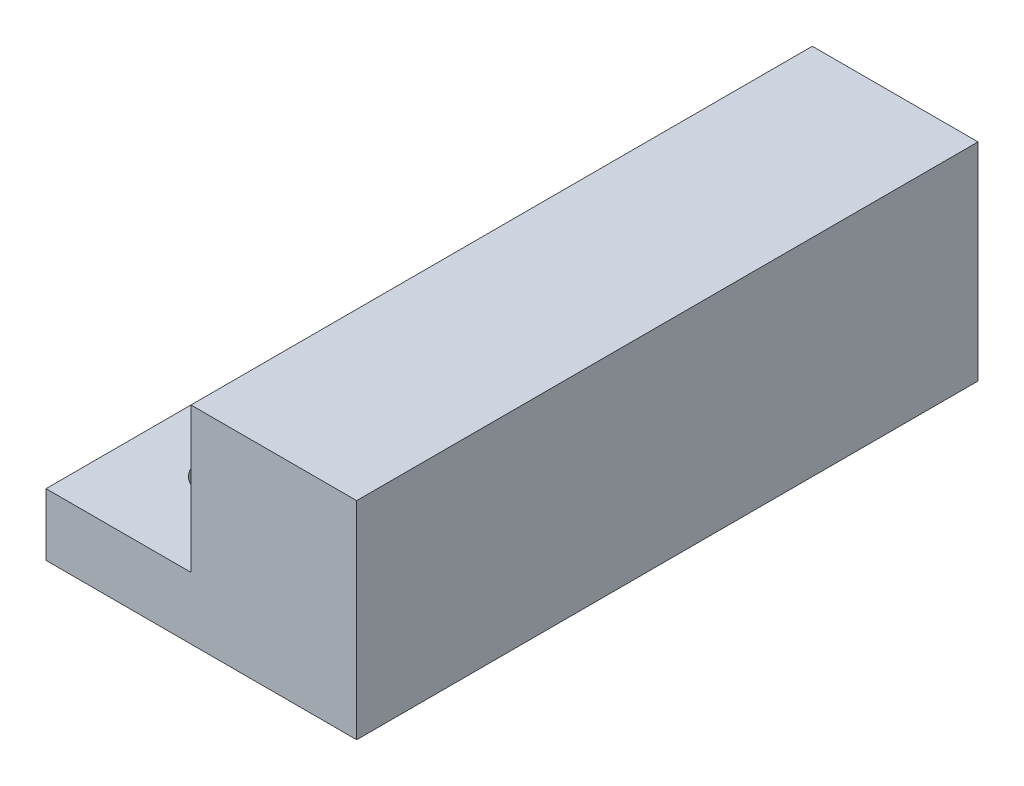
ISO-10303-21;
HEADER;
FILE_DESCRIPTION(('STEP AP214'),'2;1');
FILE_NAME('part.step','',(''),(''),'','','');
FILE_SCHEMA(('AUTOMOTIVE_DESIGN { 1 0 10303 214 1 1 1 1 }'));
ENDSEC;
DATA;
#1=APPLICATION_CONTEXT('core data for automotive mechanical design processes');
#2=APPLICATION_PROTOCOL_DEFINITION('international standard','automotive_design',2000,#1);
#3=PRODUCT_CONTEXT('',#1,'mechanical');
#4=PRODUCT('Part','Part','',(#3));
#5=PRODUCT_RELATED_PRODUCT_CATEGORY('part','',(#4));
#6=PRODUCT_DEFINITION_FORMATION('','',#4);
#7=PRODUCT_DEFINITION_CONTEXT('part definition',#1,'design');
#8=PRODUCT_DEFINITION('design','',#6,#7);
#9=PRODUCT_DEFINITION_SHAPE('','',#8);
#10=(LENGTH_UNIT() NAMED_UNIT(*) SI_UNIT(.MILLI.,.METRE.));
#11=(NAMED_UNIT(*) PLANE_ANGLE_UNIT() SI_UNIT($,.RADIAN.));
#12=(NAMED_UNIT(*) SI_UNIT($,.STERADIAN.) SOLID_ANGLE_UNIT());
#13=UNCERTAINTY_MEASURE_WITH_UNIT(LENGTH_MEASURE(1.E-05),#10,'distance_accuracy_value','');
#14=(GEOMETRIC_REPRESENTATION_CONTEXT(3) GLOBAL_UNCERTAINTY_ASSIGNED_CONTEXT((#13)) GLOBAL_UNIT_ASSIGNED_CONTEXT((#10,
#11,#12)) REPRESENTATION_CONTEXT('',''));
#15=CARTESIAN_POINT('',(0.,0.,0.));
#16=DIRECTION('',(0.,0.,1.));
#17=DIRECTION('',(1.,0.,0.));
#18=AXIS2_PLACEMENT_3D('',#15,#16,#17);
#19=CARTESIAN_POINT('',(10.16,3.81,0.));
#20=DIRECTION('',(0.,1.,0.));
#21=DIRECTION('',(0.,0.,1.));
#22=AXIS2_PLACEMENT_3D('',#19,#20,#21);
#23=PLANE('',#22);
#24=DIRECTION('',(0.,0.,-1.));
#25=VECTOR('',#24,1.);
#26=CARTESIAN_POINT('',(21.59,3.81,29.21));
#27=LINE('',#26,#25);
#28=CARTESIAN_POINT('',(21.59,3.81,29.21));
#29=VERTEX_POINT('',#28);
#30=CARTESIAN_POINT('',(21.59,3.81,-6.35));
#31=VERTEX_POINT('',#30);
#32=EDGE_CURVE('E178',#29,#31,#27,.T.);
#33=ORIENTED_EDGE('',*,*,#32,.T.);
#34=DIRECTION('',(1.,0.,0.));
#35=VECTOR('',#34,1.);
#36=CARTESIAN_POINT('',(24.13,3.81,-6.35));
#37=LINE('',#36,#35);
#38=CARTESIAN_POINT('',(16.51,3.81,-6.35));
#39=VERTEX_POINT('',#38);
#40=EDGE_CURVE('E236',#39,#31,#37,.T.);
#41=ORIENTED_EDGE('',*,*,#40,.F.);
#42=DIRECTION('',(0.,0.,1.));
#43=VECTOR('',#42,1.);
#44=CARTESIAN_POINT('',(16.51,3.81,-6.35));
#45=LINE('',#44,#43);
#46=CARTESIAN_POINT('',(16.51,3.81,29.21));
#47=VERTEX_POINT('',#46);
#48=EDGE_CURVE('E182',#39,#47,#45,.T.);
#49=ORIENTED_EDGE('',*,*,#48,.T.);
#50=DIRECTION('',(1.,0.,0.));
#51=VECTOR('',#50,1.);
#52=CARTESIAN_POINT('',(16.51,3.81,29.21));
#53=LINE('',#52,#51);
#54=EDGE_CURVE('E186',#47,#29,#53,.T.);
#55=ORIENTED_EDGE('',*,*,#54,.T.);
#56=EDGE_LOOP('',(#33,#41,#49,#55));
#57=FACE_BOUND('',#56,.T.);
#58=ADVANCED_FACE('F44',(#57),#23,.T.);
#59=DIRECTION('',(0.,0.,-1.));
#60=VECTOR('',#59,1.);
#61=CARTESIAN_POINT('',(13.97,3.81,31.75));
#62=LINE('',#61,#60);
#63=CARTESIAN_POINT('',(13.97,3.81,31.75));
#64=VERTEX_POINT('',#63);
#65=CARTESIAN_POINT('',(13.97,3.81,-6.35));
#66=VERTEX_POINT('',#65);
#67=EDGE_CURVE('E171',#64,#66,#62,.T.);
#68=ORIENTED_EDGE('',*,*,#67,.T.);
#69=CARTESIAN_POINT('',(5.08,3.81,-6.35));
#70=VERTEX_POINT('',#69);
#71=EDGE_CURVE('E237',#70,#66,#37,.T.);
#72=ORIENTED_EDGE('',*,*,#71,.F.);
#73=DIRECTION('',(0.,0.,-1.));
#74=VECTOR('',#73,1.);
#75=CARTESIAN_POINT('',(5.08,3.81,-6.35));
#76=LINE('',#75,#74);
#77=CARTESIAN_POINT('',(5.08,3.81,31.75));
#78=VERTEX_POINT('',#77);
#79=EDGE_CURVE('E231',#78,#70,#76,.T.);
#80=ORIENTED_EDGE('',*,*,#79,.F.);
#81=DIRECTION('',(-1.,0.,0.));
#82=VECTOR('',#81,1.);
#83=CARTESIAN_POINT('',(24.13,3.81,31.75));
#84=LINE('',#83,#82);
#85=EDGE_CURVE('E227',#64,#78,#84,.T.);
#86=ORIENTED_EDGE('',*,*,#85,.F.);
#87=EDGE_LOOP('',(#68,#72,#80,#86));
#88=FACE_BOUND('',#87,.T.);
#89=CARTESIAN_POINT('',(10.16,3.81,0.));
#90=DIRECTION('',(0.,-1.,0.));
#91=DIRECTION('',(0.,0.,1.));
#92=AXIS2_PLACEMENT_3D('',#89,#90,#91);
#93=CIRCLE('',#92,1.905);
#94=CARTESIAN_POINT('',(10.16,3.81,-1.905));
#95=VERTEX_POINT('',#94);
#96=EDGE_CURVE('E219',#95,#95,#93,.T.);
#97=ORIENTED_EDGE('',*,*,#96,.T.);
#98=EDGE_LOOP('',(#97));
#99=FACE_BOUND('',#98,.T.);
#100=CARTESIAN_POINT('',(10.16,3.81,25.4));
#101=DIRECTION('',(0.,-1.,0.));
#102=DIRECTION('',(0.,0.,1.));
#103=AXIS2_PLACEMENT_3D('',#100,#101,#102);
#104=CIRCLE('',#103,1.905);
#105=CARTESIAN_POINT('',(10.16,3.81,23.495));
#106=VERTEX_POINT('',#105);
#107=EDGE_CURVE('E211',#106,#106,#104,.T.);
#108=ORIENTED_EDGE('',*,*,#107,.T.);
#109=EDGE_LOOP('',(#108));
#110=FACE_BOUND('',#109,.T.);
#111=ADVANCED_FACE('F309',(#88,#99,#110),#23,.T.);
#112=CARTESIAN_POINT('',(10.16,0.,0.));
#113=DIRECTION('',(0.,1.,0.));
#114=DIRECTION('',(0.,0.,1.));
#115=AXIS2_PLACEMENT_3D('',#112,#113,#114);
#116=PLANE('',#115);
#117=DIRECTION('',(0.,0.,1.));
#118=VECTOR('',#117,1.);
#119=CARTESIAN_POINT('',(24.13,0.,-6.35));
#120=LINE('',#119,#118);
#121=CARTESIAN_POINT('',(24.13,0.,-6.35));
#122=VERTEX_POINT('',#121);
#123=CARTESIAN_POINT('',(24.13,0.,31.75));
#124=VERTEX_POINT('',#123);
#125=EDGE_CURVE('E223',#122,#124,#120,.T.);
#126=ORIENTED_EDGE('',*,*,#125,.T.);
#127=DIRECTION('',(-1.,0.,0.));
#128=VECTOR('',#127,1.);
#129=CARTESIAN_POINT('',(24.13,0.,31.75));
#130=LINE('',#129,#128);
#131=CARTESIAN_POINT('',(5.08,0.,31.75));
#132=VERTEX_POINT('',#131);
#133=EDGE_CURVE('E150',#124,#132,#130,.T.);
#134=ORIENTED_EDGE('',*,*,#133,.T.);
#135=DIRECTION('',(0.,0.,-1.));
#136=VECTOR('',#135,1.);
#137=CARTESIAN_POINT('',(5.08,0.,-6.35));
#138=LINE('',#137,#136);
#139=CARTESIAN_POINT('',(5.08,0.,-6.35));
#140=VERTEX_POINT('',#139);
#141=EDGE_CURVE('E245',#132,#140,#138,.T.);
#142=ORIENTED_EDGE('',*,*,#141,.T.);
#143=DIRECTION('',(1.,0.,0.));
#144=VECTOR('',#143,1.);
#145=CARTESIAN_POINT('',(24.13,0.,-6.35));
#146=LINE('',#145,#144);
#147=EDGE_CURVE('E232',#140,#122,#146,.T.);
#148=ORIENTED_EDGE('',*,*,#147,.T.);
#149=EDGE_LOOP('',(#126,#134,#142,#148));
#150=FACE_BOUND('',#149,.T.);
#151=CARTESIAN_POINT('',(10.16,0.,0.));
#152=DIRECTION('',(0.,-1.,0.));
#153=DIRECTION('',(0.,0.,1.));
#154=AXIS2_PLACEMENT_3D('',#151,#152,#153);
#155=CIRCLE('',#154,1.905);
#156=CARTESIAN_POINT('',(10.16,0.,-1.905));
#157=VERTEX_POINT('',#156);
#158=EDGE_CURVE('E215',#157,#157,#155,.T.);
#159=ORIENTED_EDGE('',*,*,#158,.F.);
#160=EDGE_LOOP('',(#159));
#161=FACE_BOUND('',#160,.T.);
#162=CARTESIAN_POINT('',(10.16,0.,25.4));
#163=DIRECTION('',(0.,-1.,0.));
#164=DIRECTION('',(0.,0.,1.));
#165=AXIS2_PLACEMENT_3D('',#162,#163,#164);
#166=CIRCLE('',#165,1.905);
#167=CARTESIAN_POINT('',(10.16,0.,23.495));
#168=VERTEX_POINT('',#167);
#169=EDGE_CURVE('E210',#168,#168,#166,.T.);
#170=ORIENTED_EDGE('',*,*,#169,.F.);
#171=EDGE_LOOP('',(#170));
#172=FACE_BOUND('',#171,.T.);
#173=ADVANCED_FACE('F314',(#150,#161,#172),#116,.F.);
#174=CARTESIAN_POINT('',(24.13,3.81,-6.35));
#175=DIRECTION('',(-1.,0.,0.));
#176=DIRECTION('',(0.,0.,-1.));
#177=AXIS2_PLACEMENT_3D('',#174,#175,#176);
#178=PLANE('',#177);
#179=ORIENTED_EDGE('',*,*,#125,.F.);
#180=DIRECTION('',(0.,-1.,0.));
#181=VECTOR('',#180,1.);
#182=CARTESIAN_POINT('',(24.13,3.81,-6.35));
#183=LINE('',#182,#181);
#184=CARTESIAN_POINT('',(24.13,12.7,-6.35));
#185=VERTEX_POINT('',#184);
#186=EDGE_CURVE('E159',#185,#122,#183,.T.);
#187=ORIENTED_EDGE('',*,*,#186,.F.);
#188=DIRECTION('',(0.,0.,1.));
#189=VECTOR('',#188,1.);
#190=CARTESIAN_POINT('',(24.13,12.7,-6.35));
#191=LINE('',#190,#189);
#192=CARTESIAN_POINT('',(24.13,12.7,31.75));
#193=VERTEX_POINT('',#192);
#194=EDGE_CURVE('E139',#185,#193,#191,.T.);
#195=ORIENTED_EDGE('',*,*,#194,.T.);
#196=DIRECTION('',(0.,-1.,0.));
#197=VECTOR('',#196,1.);
#198=CARTESIAN_POINT('',(24.13,3.81,31.75));
#199=LINE('',#198,#197);
#200=EDGE_CURVE('E147',#193,#124,#199,.T.);
#201=ORIENTED_EDGE('',*,*,#200,.T.);
#202=EDGE_LOOP('',(#179,#187,#195,#201));
#203=FACE_BOUND('',#202,.T.);
#204=ADVANCED_FACE('F158',(#203),#178,.F.);
#205=CARTESIAN_POINT('',(24.13,3.81,31.75));
#206=DIRECTION('',(0.,0.,-1.));
#207=DIRECTION('',(1.,0.,0.));
#208=AXIS2_PLACEMENT_3D('',#205,#206,#207);
#209=PLANE('',#208);
#210=ORIENTED_EDGE('',*,*,#133,.F.);
#211=ORIENTED_EDGE('',*,*,#200,.F.);
#212=DIRECTION('',(-1.,0.,0.));
#213=VECTOR('',#212,1.);
#214=CARTESIAN_POINT('',(24.13,12.7,31.75));
#215=LINE('',#214,#213);
#216=CARTESIAN_POINT('',(13.97,12.7,31.75));
#217=VERTEX_POINT('',#216);
#218=EDGE_CURVE('E134',#193,#217,#215,.T.);
#219=ORIENTED_EDGE('',*,*,#218,.T.);
#220=DIRECTION('',(0.,-1.,0.));
#221=VECTOR('',#220,1.);
#222=CARTESIAN_POINT('',(13.97,10.16,31.75));
#223=LINE('',#222,#221);
#224=EDGE_CURVE('E207',#217,#64,#223,.T.);
#225=ORIENTED_EDGE('',*,*,#224,.T.);
#226=ORIENTED_EDGE('',*,*,#85,.T.);
#227=DIRECTION('',(0.,-1.,0.));
#228=VECTOR('',#227,1.);
#229=CARTESIAN_POINT('',(5.08,3.81,31.75));
#230=LINE('',#229,#228);
#231=EDGE_CURVE('E156',#78,#132,#230,.T.);
#232=ORIENTED_EDGE('',*,*,#231,.T.);
#233=EDGE_LOOP('',(#210,#211,#219,#225,#226,#232));
#234=FACE_BOUND('',#233,.T.);
#235=ADVANCED_FACE('F148',(#234),#209,.F.);
#236=CARTESIAN_POINT('',(5.08,3.81,-6.35));
#237=DIRECTION('',(1.,0.,0.));
#238=DIRECTION('',(0.,0.,1.));
#239=AXIS2_PLACEMENT_3D('',#236,#237,#238);
#240=PLANE('',#239);
#241=ORIENTED_EDGE('',*,*,#141,.F.);
#242=ORIENTED_EDGE('',*,*,#231,.F.);
#243=ORIENTED_EDGE('',*,*,#79,.T.);
#244=DIRECTION('',(0.,-1.,0.));
#245=VECTOR('',#244,1.);
#246=CARTESIAN_POINT('',(5.08,3.81,-6.35));
#247=LINE('',#246,#245);
#248=EDGE_CURVE('E254',#70,#140,#247,.T.);
#249=ORIENTED_EDGE('',*,*,#248,.T.);
#250=EDGE_LOOP('',(#241,#242,#243,#249));
#251=FACE_BOUND('',#250,.T.);
#252=ADVANCED_FACE('F325',(#251),#240,.F.);
#253=CARTESIAN_POINT('',(24.13,3.81,-6.35));
#254=DIRECTION('',(0.,0.,1.));
#255=DIRECTION('',(-1.,0.,0.));
#256=AXIS2_PLACEMENT_3D('',#253,#254,#255);
#257=PLANE('',#256);
#258=ORIENTED_EDGE('',*,*,#186,.T.);
#259=ORIENTED_EDGE('',*,*,#147,.F.);
#260=ORIENTED_EDGE('',*,*,#248,.F.);
#261=ORIENTED_EDGE('',*,*,#71,.T.);
#262=DIRECTION('',(0.,-1.,0.));
#263=VECTOR('',#262,1.);
#264=CARTESIAN_POINT('',(13.97,10.16,-6.35));
#265=LINE('',#264,#263);
#266=CARTESIAN_POINT('',(13.97,12.7,-6.35));
#267=VERTEX_POINT('',#266);
#268=EDGE_CURVE('E204',#267,#66,#265,.T.);
#269=ORIENTED_EDGE('',*,*,#268,.F.);
#270=DIRECTION('',(1.,0.,0.));
#271=VECTOR('',#270,1.);
#272=CARTESIAN_POINT('',(24.13,12.7,-6.35));
#273=LINE('',#272,#271);
#274=EDGE_CURVE('E169',#267,#185,#273,.T.);
#275=ORIENTED_EDGE('',*,*,#274,.T.);
#276=EDGE_LOOP('',(#258,#259,#260,#261,#269,#275));
#277=FACE_BOUND('',#276,.T.);
#278=DIRECTION('',(0.,-1.,0.));
#279=VECTOR('',#278,1.);
#280=CARTESIAN_POINT('',(16.51,10.16,-6.35));
#281=LINE('',#280,#279);
#282=CARTESIAN_POINT('',(16.51,8.89000000000001,-6.35));
#283=VERTEX_POINT('',#282);
#284=EDGE_CURVE('E201',#283,#39,#281,.T.);
#285=ORIENTED_EDGE('',*,*,#284,.T.);
#286=ORIENTED_EDGE('',*,*,#40,.T.);
#287=DIRECTION('',(0.,-1.,0.));
#288=VECTOR('',#287,1.);
#289=CARTESIAN_POINT('',(21.59,10.16,-6.35));
#290=LINE('',#289,#288);
#291=CARTESIAN_POINT('',(21.59,8.89,-6.35));
#292=VERTEX_POINT('',#291);
#293=EDGE_CURVE('E177',#292,#31,#290,.T.);
#294=ORIENTED_EDGE('',*,*,#293,.F.);
#295=DIRECTION('',(-0.707106781186551,0.707106781186544,0.));
#296=VECTOR('',#295,1.);
#297=CARTESIAN_POINT('',(25.4,5.08000000000003,-6.35));
#298=LINE('',#297,#296);
#299=CARTESIAN_POINT('',(20.32,10.16,-6.35));
#300=VERTEX_POINT('',#299);
#301=EDGE_CURVE('E11',#300,#292,#298,.F.);
#302=ORIENTED_EDGE('',*,*,#301,.F.);
#303=DIRECTION('',(1.,0.,0.));
#304=VECTOR('',#303,1.);
#305=CARTESIAN_POINT('',(24.13,10.16,-6.35));
#306=LINE('',#305,#304);
#307=CARTESIAN_POINT('',(17.78,10.16,-6.35));
#308=VERTEX_POINT('',#307);
#309=EDGE_CURVE('E161',#308,#300,#306,.T.);
#310=ORIENTED_EDGE('',*,*,#309,.F.);
#311=DIRECTION('',(-0.707106781186552,-0.707106781186543,0.));
#312=VECTOR('',#311,1.);
#313=CARTESIAN_POINT('',(17.78,10.16,-6.35));
#314=LINE('',#313,#312);
#315=EDGE_CURVE('E53',#283,#308,#314,.F.);
#316=ORIENTED_EDGE('',*,*,#315,.F.);
#317=EDGE_LOOP('',(#285,#286,#294,#302,#310,#316));
#318=FACE_BOUND('',#317,.T.);
#319=ADVANCED_FACE('F281',(#277,#318),#257,.F.);
#320=CARTESIAN_POINT('',(10.16,3.81,0.));
#321=DIRECTION('',(0.,-1.,0.));
#322=DIRECTION('',(0.,0.,-1.));
#323=AXIS2_PLACEMENT_3D('',#320,#321,#322);
#324=CYLINDRICAL_SURFACE('',#323,1.905);
#325=CARTESIAN_POINT('',(10.16,3.81,-1.905));
#326=CARTESIAN_POINT('',(10.16,3.7703125,-1.905));
#327=CARTESIAN_POINT('',(10.16,3.730625,-1.905));
#328=CARTESIAN_POINT('',(10.16,3.65125,-1.905));
#329=CARTESIAN_POINT('',(10.16,3.6115625,-1.905));
#330=CARTESIAN_POINT('',(10.16,3.5321875,-1.905));
#331=CARTESIAN_POINT('',(10.16,3.4925,-1.905));
#332=CARTESIAN_POINT('',(10.16,3.413125,-1.905));
#333=CARTESIAN_POINT('',(10.16,3.3734375,-1.905));
#334=CARTESIAN_POINT('',(10.16,3.2940625,-1.905));
#335=CARTESIAN_POINT('',(10.16,3.254375,-1.905));
#336=CARTESIAN_POINT('',(10.16,3.175,-1.905));
#337=CARTESIAN_POINT('',(10.16,3.1353125,-1.905));
#338=CARTESIAN_POINT('',(10.16,3.0559375,-1.905));
#339=CARTESIAN_POINT('',(10.16,3.01625,-1.905));
#340=CARTESIAN_POINT('',(10.16,2.936875,-1.905));
#341=CARTESIAN_POINT('',(10.16,2.8971875,-1.905));
#342=CARTESIAN_POINT('',(10.16,2.8178125,-1.905));
#343=CARTESIAN_POINT('',(10.16,2.778125,-1.905));
#344=CARTESIAN_POINT('',(10.16,2.69875,-1.905));
#345=CARTESIAN_POINT('',(10.16,2.6590625,-1.905));
#346=CARTESIAN_POINT('',(10.16,2.5796875,-1.905));
#347=CARTESIAN_POINT('',(10.16,2.54,-1.905));
#348=CARTESIAN_POINT('',(10.16,2.460625,-1.905));
#349=CARTESIAN_POINT('',(10.16,2.4209375,-1.905));
#350=CARTESIAN_POINT('',(10.16,2.3415625,-1.905));
#351=CARTESIAN_POINT('',(10.16,2.301875,-1.905));
#352=CARTESIAN_POINT('',(10.16,2.2225,-1.905));
#353=CARTESIAN_POINT('',(10.16,2.1828125,-1.905));
#354=CARTESIAN_POINT('',(10.16,2.1034375,-1.905));
#355=CARTESIAN_POINT('',(10.16,2.06375,-1.905));
#356=CARTESIAN_POINT('',(10.16,1.984375,-1.905));
#357=CARTESIAN_POINT('',(10.16,1.9446875,-1.905));
#358=CARTESIAN_POINT('',(10.16,1.8653125,-1.905));
#359=CARTESIAN_POINT('',(10.16,1.825625,-1.905));
#360=CARTESIAN_POINT('',(10.16,1.74625,-1.905));
#361=CARTESIAN_POINT('',(10.16,1.7065625,-1.905));
#362=CARTESIAN_POINT('',(10.16,1.6271875,-1.905));
#363=CARTESIAN_POINT('',(10.16,1.5875,-1.905));
#364=CARTESIAN_POINT('',(10.16,1.508125,-1.905));
#365=CARTESIAN_POINT('',(10.16,1.4684375,-1.905));
#366=CARTESIAN_POINT('',(10.16,1.3890625,-1.905));
#367=CARTESIAN_POINT('',(10.16,1.349375,-1.905));
#368=CARTESIAN_POINT('',(10.16,1.27,-1.905));
#369=CARTESIAN_POINT('',(10.16,1.2303125,-1.905));
#370=CARTESIAN_POINT('',(10.16,1.1509375,-1.905));
#371=CARTESIAN_POINT('',(10.16,1.11125,-1.905));
#372=CARTESIAN_POINT('',(10.16,1.031875,-1.905));
#373=CARTESIAN_POINT('',(10.16,0.9921875,-1.905));
#374=CARTESIAN_POINT('',(10.16,0.9128125,-1.905));
#375=CARTESIAN_POINT('',(10.16,0.873125,-1.905));
#376=CARTESIAN_POINT('',(10.16,0.79375,-1.905));
#377=CARTESIAN_POINT('',(10.16,0.7540625,-1.905));
#378=CARTESIAN_POINT('',(10.16,0.6746875,-1.905));
#379=CARTESIAN_POINT('',(10.16,0.635,-1.905));
#380=CARTESIAN_POINT('',(10.16,0.555625,-1.905));
#381=CARTESIAN_POINT('',(10.16,0.5159375,-1.905));
#382=CARTESIAN_POINT('',(10.16,0.4365625,-1.905));
#383=CARTESIAN_POINT('',(10.16,0.396875,-1.905));
#384=CARTESIAN_POINT('',(10.16,0.3175,-1.905));
#385=CARTESIAN_POINT('',(10.16,0.2778125,-1.905));
#386=CARTESIAN_POINT('',(10.16,0.1984375,-1.905));
#387=CARTESIAN_POINT('',(10.16,0.15875,-1.905));
#388=CARTESIAN_POINT('',(10.16,0.0793749999999999,-1.905));
#389=CARTESIAN_POINT('',(10.16,0.0396874999999999,-1.905));
#390=CARTESIAN_POINT('',(10.16,0.,-1.905));
#391=B_SPLINE_CURVE_WITH_KNOTS('',3,(#325,#326,#327,#328,#329,#330,#331,#332,#333,#334,#335,
#336,#337,#338,#339,#340,#341,#342,#343,#344,#345,#346,#347,#348,#349,#350,#351,#352,#353,#354,
#355,#356,#357,#358,#359,#360,#361,#362,#363,#364,#365,#366,#367,#368,#369,#370,#371,#372,#373,
#374,#375,#376,#377,#378,#379,#380,#381,#382,#383,#384,#385,#386,#387,#388,#389,#390),
.UNSPECIFIED.,.F.,.F.,(4,2,2,2,2,2,2,2,2,2,2,2,2,2,2,2,2,2,2,2,2,2,2,2,2,2,2,2,2,2,2,2,4),(0.,
0.1190625,0.238125,0.3571875,0.47625,0.5953125,0.714375,0.833437499999999,0.9525,1.0715625,
1.190625,1.3096875,1.42875,1.5478125,1.666875,1.7859375,1.905,2.0240625,2.143125,2.2621875,
2.38125,2.5003125,2.619375,2.7384375,2.8575,2.9765625,3.095625,3.2146875,3.33375,3.4528125,
3.571875,3.6909375,3.81),.UNSPECIFIED.);
#392=EDGE_CURVE('BSEAM318',#95,#157,#391,.T.);
#393=ORIENTED_EDGE('',*,*,#96,.F.);
#394=ORIENTED_EDGE('',*,*,#158,.T.);
#395=ORIENTED_EDGE('',*,*,#392,.T.);
#396=ORIENTED_EDGE('',*,*,#392,.F.);
#397=EDGE_LOOP('',(#393,#395,#394,#396));
#398=FACE_BOUND('',#397,.T.);
#399=ADVANCED_FACE('F318',(#398),#324,.F.);
#400=CARTESIAN_POINT('',(10.16,3.81,25.4));
#401=DIRECTION('',(0.,-1.,0.));
#402=DIRECTION('',(0.,0.,-1.));
#403=AXIS2_PLACEMENT_3D('',#400,#401,#402);
#404=CYLINDRICAL_SURFACE('',#403,1.905);
#405=CARTESIAN_POINT('',(10.16,3.81,23.495));
#406=CARTESIAN_POINT('',(10.16,3.7703125,23.495));
#407=CARTESIAN_POINT('',(10.16,3.730625,23.495));
#408=CARTESIAN_POINT('',(10.16,3.65125,23.495));
#409=CARTESIAN_POINT('',(10.16,3.6115625,23.495));
#410=CARTESIAN_POINT('',(10.16,3.5321875,23.495));
#411=CARTESIAN_POINT('',(10.16,3.4925,23.495));
#412=CARTESIAN_POINT('',(10.16,3.413125,23.495));
#413=CARTESIAN_POINT('',(10.16,3.3734375,23.495));
#414=CARTESIAN_POINT('',(10.16,3.2940625,23.495));
#415=CARTESIAN_POINT('',(10.16,3.254375,23.495));
#416=CARTESIAN_POINT('',(10.16,3.175,23.495));
#417=CARTESIAN_POINT('',(10.16,3.1353125,23.495));
#418=CARTESIAN_POINT('',(10.16,3.0559375,23.495));
#419=CARTESIAN_POINT('',(10.16,3.01625,23.495));
#420=CARTESIAN_POINT('',(10.16,2.936875,23.495));
#421=CARTESIAN_POINT('',(10.16,2.8971875,23.495));
#422=CARTESIAN_POINT('',(10.16,2.8178125,23.495));
#423=CARTESIAN_POINT('',(10.16,2.778125,23.495));
#424=CARTESIAN_POINT('',(10.16,2.69875,23.495));
#425=CARTESIAN_POINT('',(10.16,2.6590625,23.495));
#426=CARTESIAN_POINT('',(10.16,2.5796875,23.495));
#427=CARTESIAN_POINT('',(10.16,2.54,23.495));
#428=CARTESIAN_POINT('',(10.16,2.460625,23.495));
#429=CARTESIAN_POINT('',(10.16,2.4209375,23.495));
#430=CARTESIAN_POINT('',(10.16,2.3415625,23.495));
#431=CARTESIAN_POINT('',(10.16,2.301875,23.495));
#432=CARTESIAN_POINT('',(10.16,2.2225,23.495));
#433=CARTESIAN_POINT('',(10.16,2.1828125,23.495));
#434=CARTESIAN_POINT('',(10.16,2.1034375,23.495));
#435=CARTESIAN_POINT('',(10.16,2.06375,23.495));
#436=CARTESIAN_POINT('',(10.16,1.984375,23.495));
#437=CARTESIAN_POINT('',(10.16,1.9446875,23.495));
#438=CARTESIAN_POINT('',(10.16,1.8653125,23.495));
#439=CARTESIAN_POINT('',(10.16,1.825625,23.495));
#440=CARTESIAN_POINT('',(10.16,1.74625,23.495));
#441=CARTESIAN_POINT('',(10.16,1.7065625,23.495));
#442=CARTESIAN_POINT('',(10.16,1.6271875,23.495));
#443=CARTESIAN_POINT('',(10.16,1.5875,23.495));
#444=CARTESIAN_POINT('',(10.16,1.508125,23.495));
#445=CARTESIAN_POINT('',(10.16,1.4684375,23.495));
#446=CARTESIAN_POINT('',(10.16,1.3890625,23.495));
#447=CARTESIAN_POINT('',(10.16,1.349375,23.495));
#448=CARTESIAN_POINT('',(10.16,1.27,23.495));
#449=CARTESIAN_POINT('',(10.16,1.2303125,23.495));
#450=CARTESIAN_POINT('',(10.16,1.1509375,23.495));
#451=CARTESIAN_POINT('',(10.16,1.11125,23.495));
#452=CARTESIAN_POINT('',(10.16,1.031875,23.495));
#453=CARTESIAN_POINT('',(10.16,0.9921875,23.495));
#454=CARTESIAN_POINT('',(10.16,0.9128125,23.495));
#455=CARTESIAN_POINT('',(10.16,0.873125,23.495));
#456=CARTESIAN_POINT('',(10.16,0.79375,23.495));
#457=CARTESIAN_POINT('',(10.16,0.7540625,23.495));
#458=CARTESIAN_POINT('',(10.16,0.6746875,23.495));
#459=CARTESIAN_POINT('',(10.16,0.635,23.495));
#460=CARTESIAN_POINT('',(10.16,0.555625,23.495));
#461=CARTESIAN_POINT('',(10.16,0.5159375,23.495));
#462=CARTESIAN_POINT('',(10.16,0.4365625,23.495));
#463=CARTESIAN_POINT('',(10.16,0.396875,23.495));
#464=CARTESIAN_POINT('',(10.16,0.3175,23.495));
#465=CARTESIAN_POINT('',(10.16,0.2778125,23.495));
#466=CARTESIAN_POINT('',(10.16,0.1984375,23.495));
#467=CARTESIAN_POINT('',(10.16,0.15875,23.495));
#468=CARTESIAN_POINT('',(10.16,0.0793749999999999,23.495));
#469=CARTESIAN_POINT('',(10.16,0.0396874999999999,23.495));
#470=CARTESIAN_POINT('',(10.16,0.,23.495));
#471=B_SPLINE_CURVE_WITH_KNOTS('',3,(#405,#406,#407,#408,#409,#410,#411,#412,#413,#414,#415,
#416,#417,#418,#419,#420,#421,#422,#423,#424,#425,#426,#427,#428,#429,#430,#431,#432,#433,#434,
#435,#436,#437,#438,#439,#440,#441,#442,#443,#444,#445,#446,#447,#448,#449,#450,#451,#452,#453,
#454,#455,#456,#457,#458,#459,#460,#461,#462,#463,#464,#465,#466,#467,#468,#469,#470),
.UNSPECIFIED.,.F.,.F.,(4,2,2,2,2,2,2,2,2,2,2,2,2,2,2,2,2,2,2,2,2,2,2,2,2,2,2,2,2,2,2,2,4),(0.,
0.1190625,0.238125,0.3571875,0.47625,0.5953125,0.714375,0.833437499999999,0.9525,1.0715625,
1.190625,1.3096875,1.42875,1.5478125,1.666875,1.7859375,1.905,2.0240625,2.143125,2.2621875,
2.38125,2.5003125,2.619375,2.7384375,2.8575,2.9765625,3.095625,3.2146875,3.33375,3.4528125,
3.571875,3.6909375,3.81),.UNSPECIFIED.);
#472=EDGE_CURVE('BSEAM380',#106,#168,#471,.T.);
#473=ORIENTED_EDGE('',*,*,#107,.F.);
#474=ORIENTED_EDGE('',*,*,#169,.T.);
#475=ORIENTED_EDGE('',*,*,#472,.T.);
#476=ORIENTED_EDGE('',*,*,#472,.F.);
#477=EDGE_LOOP('',(#473,#475,#474,#476));
#478=FACE_BOUND('',#477,.T.);
#479=ADVANCED_FACE('F380',(#478),#404,.F.);
#480=CARTESIAN_POINT('',(13.97,10.16,31.75));
#481=DIRECTION('',(1.,0.,0.));
#482=DIRECTION('',(0.,0.,1.));
#483=AXIS2_PLACEMENT_3D('',#480,#481,#482);
#484=PLANE('',#483);
#485=ORIENTED_EDGE('',*,*,#67,.F.);
#486=ORIENTED_EDGE('',*,*,#224,.F.);
#487=DIRECTION('',(0.,0.,-1.));
#488=VECTOR('',#487,1.);
#489=CARTESIAN_POINT('',(13.97,12.7,-6.35));
#490=LINE('',#489,#488);
#491=EDGE_CURVE('E141',#217,#267,#490,.T.);
#492=ORIENTED_EDGE('',*,*,#491,.T.);
#493=ORIENTED_EDGE('',*,*,#268,.T.);
#494=EDGE_LOOP('',(#485,#486,#492,#493));
#495=FACE_BOUND('',#494,.T.);
#496=ADVANCED_FACE('F370',(#495),#484,.F.);
#497=CARTESIAN_POINT('',(16.51,10.16,-6.35));
#498=DIRECTION('',(-1.,0.,0.));
#499=DIRECTION('',(0.,0.,-1.));
#500=AXIS2_PLACEMENT_3D('',#497,#498,#499);
#501=PLANE('',#500);
#502=DIRECTION('',(0.,-1.,0.));
#503=VECTOR('',#502,1.);
#504=CARTESIAN_POINT('',(16.51,10.16,29.21));
#505=LINE('',#504,#503);
#506=CARTESIAN_POINT('',(16.51,8.89000000000001,29.21));
#507=VERTEX_POINT('',#506);
#508=EDGE_CURVE('E198',#507,#47,#505,.T.);
#509=ORIENTED_EDGE('',*,*,#508,.T.);
#510=ORIENTED_EDGE('',*,*,#48,.F.);
#511=ORIENTED_EDGE('',*,*,#284,.F.);
#512=DIRECTION('',(0.,0.,-1.));
#513=VECTOR('',#512,1.);
#514=CARTESIAN_POINT('',(16.51,8.89000000000001,-6.35));
#515=LINE('',#514,#513);
#516=EDGE_CURVE('E67',#507,#283,#515,.T.);
#517=ORIENTED_EDGE('',*,*,#516,.F.);
#518=EDGE_LOOP('',(#509,#510,#511,#517));
#519=FACE_BOUND('',#518,.T.);
#520=ADVANCED_FACE('F292',(#519),#501,.F.);
#521=CARTESIAN_POINT('',(16.51,10.16,29.21));
#522=DIRECTION('',(0.,0.,1.));
#523=DIRECTION('',(-1.,0.,0.));
#524=AXIS2_PLACEMENT_3D('',#521,#522,#523);
#525=PLANE('',#524);
#526=DIRECTION('',(1.,0.,0.));
#527=VECTOR('',#526,1.);
#528=CARTESIAN_POINT('',(16.51,10.16,29.21));
#529=LINE('',#528,#527);
#530=CARTESIAN_POINT('',(17.78,10.16,29.21));
#531=VERTEX_POINT('',#530);
#532=CARTESIAN_POINT('',(20.32,10.16,29.21));
#533=VERTEX_POINT('',#532);
#534=EDGE_CURVE('E173',#531,#533,#529,.T.);
#535=ORIENTED_EDGE('',*,*,#534,.T.);
#536=DIRECTION('',(0.707106781186551,-0.707106781186544,0.));
#537=VECTOR('',#536,1.);
#538=CARTESIAN_POINT('',(20.32,10.16,29.21));
#539=LINE('',#538,#537);
#540=CARTESIAN_POINT('',(21.59,8.89,29.21));
#541=VERTEX_POINT('',#540);
#542=EDGE_CURVE('E264',#541,#533,#539,.F.);
#543=ORIENTED_EDGE('',*,*,#542,.F.);
#544=DIRECTION('',(0.,-1.,0.));
#545=VECTOR('',#544,1.);
#546=CARTESIAN_POINT('',(21.59,10.16,29.21));
#547=LINE('',#546,#545);
#548=EDGE_CURVE('E195',#541,#29,#547,.T.);
#549=ORIENTED_EDGE('',*,*,#548,.T.);
#550=ORIENTED_EDGE('',*,*,#54,.F.);
#551=ORIENTED_EDGE('',*,*,#508,.F.);
#552=DIRECTION('',(0.707106781186552,0.707106781186543,0.));
#553=VECTOR('',#552,1.);
#554=CARTESIAN_POINT('',(17.78,10.16,29.21));
#555=LINE('',#554,#553);
#556=EDGE_CURVE('E268',#531,#507,#555,.F.);
#557=ORIENTED_EDGE('',*,*,#556,.F.);
#558=EDGE_LOOP('',(#535,#543,#549,#550,#551,#557));
#559=FACE_BOUND('',#558,.T.);
#560=ADVANCED_FACE('F288',(#559),#525,.F.);
#561=CARTESIAN_POINT('',(21.59,10.16,29.21));
#562=DIRECTION('',(1.,0.,0.));
#563=DIRECTION('',(0.,0.,1.));
#564=AXIS2_PLACEMENT_3D('',#561,#562,#563);
#565=PLANE('',#564);
#566=ORIENTED_EDGE('',*,*,#293,.T.);
#567=ORIENTED_EDGE('',*,*,#32,.F.);
#568=ORIENTED_EDGE('',*,*,#548,.F.);
#569=DIRECTION('',(0.,0.,1.));
#570=VECTOR('',#569,1.);
#571=CARTESIAN_POINT('',(21.59,8.89,29.21));
#572=LINE('',#571,#570);
#573=EDGE_CURVE('E60',#292,#541,#572,.T.);
#574=ORIENTED_EDGE('',*,*,#573,.F.);
#575=EDGE_LOOP('',(#566,#567,#568,#574));
#576=FACE_BOUND('',#575,.T.);
#577=ADVANCED_FACE('F299',(#576),#565,.F.);
#578=CARTESIAN_POINT('',(10.16,10.16,0.));
#579=DIRECTION('',(0.,1.,0.));
#580=DIRECTION('',(0.,0.,1.));
#581=AXIS2_PLACEMENT_3D('',#578,#579,#580);
#582=PLANE('',#581);
#583=ORIENTED_EDGE('',*,*,#309,.T.);
#584=DIRECTION('',(0.,0.,-1.));
#585=VECTOR('',#584,1.);
#586=CARTESIAN_POINT('',(20.32,10.16,-6.35));
#587=LINE('',#586,#585);
#588=EDGE_CURVE('E155',#533,#300,#587,.T.);
#589=ORIENTED_EDGE('',*,*,#588,.F.);
#590=ORIENTED_EDGE('',*,*,#534,.F.);
#591=DIRECTION('',(0.,0.,1.));
#592=VECTOR('',#591,1.);
#593=CARTESIAN_POINT('',(17.78,10.16,29.21));
#594=LINE('',#593,#592);
#595=EDGE_CURVE('E261',#308,#531,#594,.T.);
#596=ORIENTED_EDGE('',*,*,#595,.F.);
#597=EDGE_LOOP('',(#583,#589,#590,#596));
#598=FACE_BOUND('',#597,.T.);
#599=ADVANCED_FACE('F284',(#598),#582,.F.);
#600=CARTESIAN_POINT('',(10.16,12.7,0.));
#601=DIRECTION('',(0.,1.,0.));
#602=DIRECTION('',(0.,0.,1.));
#603=AXIS2_PLACEMENT_3D('',#600,#601,#602);
#604=PLANE('',#603);
#605=ORIENTED_EDGE('',*,*,#194,.F.);
#606=ORIENTED_EDGE('',*,*,#274,.F.);
#607=ORIENTED_EDGE('',*,*,#491,.F.);
#608=ORIENTED_EDGE('',*,*,#218,.F.);
#609=EDGE_LOOP('',(#605,#606,#607,#608));
#610=FACE_BOUND('',#609,.T.);
#611=ADVANCED_FACE('F136',(#610),#604,.T.);
#612=CARTESIAN_POINT('',(17.78,10.16,0.));
#613=DIRECTION('',(0.707106781186543,-0.707106781186552,0.));
#614=DIRECTION('',(0.,0.,-1.));
#615=AXIS2_PLACEMENT_3D('',#612,#613,#614);
#616=PLANE('',#615);
#617=ORIENTED_EDGE('',*,*,#315,.T.);
#618=ORIENTED_EDGE('',*,*,#595,.T.);
#619=ORIENTED_EDGE('',*,*,#556,.T.);
#620=ORIENTED_EDGE('',*,*,#516,.T.);
#621=EDGE_LOOP('',(#617,#618,#619,#620));
#622=FACE_BOUND('',#621,.T.);
#623=ADVANCED_FACE('F276',(#622),#616,.T.);
#624=CARTESIAN_POINT('',(20.32,10.16,0.));
#625=DIRECTION('',(-0.707106781186544,-0.707106781186551,0.));
#626=DIRECTION('',(0.,0.,1.));
#627=AXIS2_PLACEMENT_3D('',#624,#625,#626);
#628=PLANE('',#627);
#629=ORIENTED_EDGE('',*,*,#542,.T.);
#630=ORIENTED_EDGE('',*,*,#588,.T.);
#631=ORIENTED_EDGE('',*,*,#301,.T.);
#632=ORIENTED_EDGE('',*,*,#573,.T.);
#633=EDGE_LOOP('',(#629,#630,#631,#632));
#634=FACE_BOUND('',#633,.T.);
#635=ADVANCED_FACE('F46',(#634),#628,.T.);
#636=CLOSED_SHELL('',(#58,#111,#173,#204,#235,#252,#319,#399,#479,#496,#520,#560,#577,#599,#611,
#623,#635));
#637=MANIFOLD_SOLID_BREP('B2',#636);
#638=ADVANCED_BREP_SHAPE_REPRESENTATION('',(#18,#637),#14);
#639=SHAPE_DEFINITION_REPRESENTATION(#9,#638);
ENDSEC;
END-ISO-10303-21;
